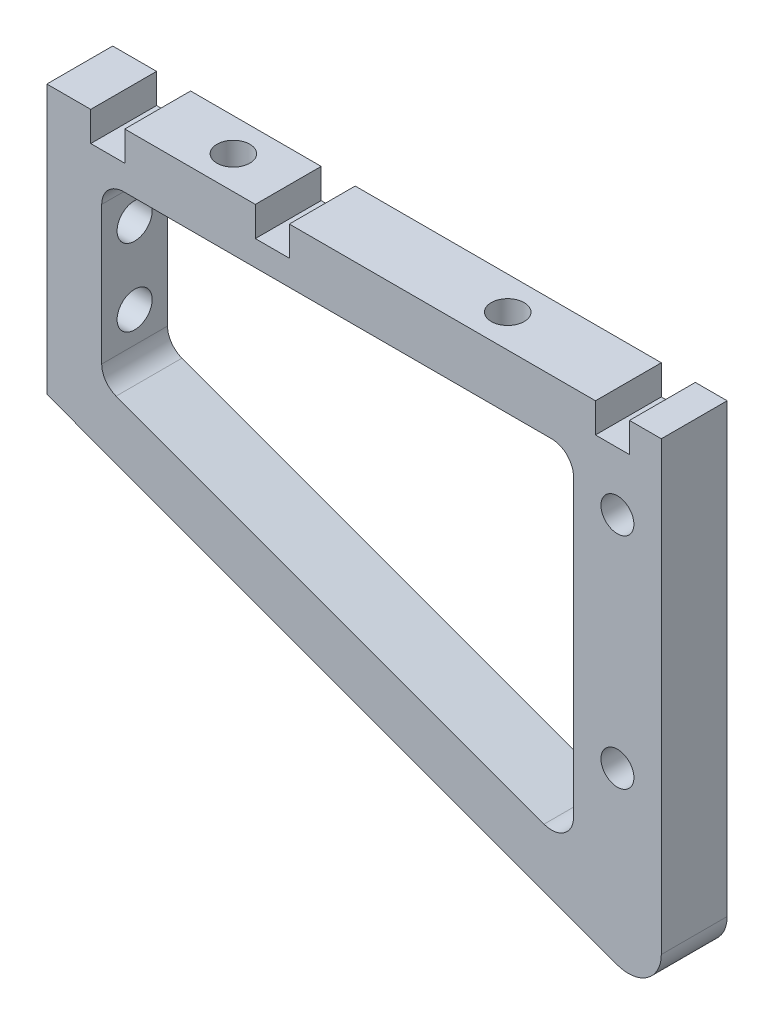
ISO-10303-21;
HEADER;
FILE_DESCRIPTION(('STEP AP214'),'2;1');
FILE_NAME('part.step','',(''),(''),'','','');
FILE_SCHEMA(('AUTOMOTIVE_DESIGN { 1 0 10303 214 1 1 1 1 }'));
ENDSEC;
DATA;
#1=APPLICATION_CONTEXT('core data for automotive mechanical design processes');
#2=APPLICATION_PROTOCOL_DEFINITION('international standard','automotive_design',2000,#1);
#3=PRODUCT_CONTEXT('',#1,'mechanical');
#4=PRODUCT('Part','Part','',(#3));
#5=PRODUCT_RELATED_PRODUCT_CATEGORY('part','',(#4));
#6=PRODUCT_DEFINITION_FORMATION('','',#4);
#7=PRODUCT_DEFINITION_CONTEXT('part definition',#1,'design');
#8=PRODUCT_DEFINITION('design','',#6,#7);
#9=PRODUCT_DEFINITION_SHAPE('','',#8);
#10=(LENGTH_UNIT() NAMED_UNIT(*) SI_UNIT(.MILLI.,.METRE.));
#11=(NAMED_UNIT(*) PLANE_ANGLE_UNIT() SI_UNIT($,.RADIAN.));
#12=(NAMED_UNIT(*) SI_UNIT($,.STERADIAN.) SOLID_ANGLE_UNIT());
#13=UNCERTAINTY_MEASURE_WITH_UNIT(LENGTH_MEASURE(1.E-05),#10,'distance_accuracy_value','');
#14=(GEOMETRIC_REPRESENTATION_CONTEXT(3) GLOBAL_UNCERTAINTY_ASSIGNED_CONTEXT((#13)) GLOBAL_UNIT_ASSIGNED_CONTEXT((#10,
#11,#12)) REPRESENTATION_CONTEXT('',''));
#15=CARTESIAN_POINT('',(0.,0.,0.));
#16=DIRECTION('',(0.,0.,1.));
#17=DIRECTION('',(1.,0.,0.));
#18=AXIS2_PLACEMENT_3D('',#15,#16,#17);
#19=CARTESIAN_POINT('',(0.,45.,6.));
#20=DIRECTION('',(0.,-1.,0.));
#21=DIRECTION('',(0.,0.,-1.));
#22=AXIS2_PLACEMENT_3D('',#19,#20,#21);
#23=PLANE('',#22);
#24=DIRECTION('',(-1.,0.,0.));
#25=VECTOR('',#24,1.);
#26=CARTESIAN_POINT('',(0.,45.,6.));
#27=LINE('',#26,#25);
#28=CARTESIAN_POINT('',(-52.,45.,6.));
#29=VERTEX_POINT('',#28);
#30=CARTESIAN_POINT('',(-56.,45.,6.));
#31=VERTEX_POINT('',#30);
#32=EDGE_CURVE('E352',#29,#31,#27,.T.);
#33=ORIENTED_EDGE('',*,*,#32,.F.);
#34=DIRECTION('',(0.,0.,1.));
#35=VECTOR('',#34,1.);
#36=CARTESIAN_POINT('',(-52.,45.,0.));
#37=LINE('',#36,#35);
#38=CARTESIAN_POINT('',(-52.,45.,0.));
#39=VERTEX_POINT('',#38);
#40=EDGE_CURVE('E240',#39,#29,#37,.T.);
#41=ORIENTED_EDGE('',*,*,#40,.F.);
#42=DIRECTION('',(-1.,0.,0.));
#43=VECTOR('',#42,1.);
#44=CARTESIAN_POINT('',(0.,45.,0.));
#45=LINE('',#44,#43);
#46=CARTESIAN_POINT('',(-56.,45.,0.));
#47=VERTEX_POINT('',#46);
#48=EDGE_CURVE('E227',#39,#47,#45,.T.);
#49=ORIENTED_EDGE('',*,*,#48,.T.);
#50=DIRECTION('',(0.,0.,-1.));
#51=VECTOR('',#50,1.);
#52=CARTESIAN_POINT('',(-56.,45.,6.));
#53=LINE('',#52,#51);
#54=EDGE_CURVE('E371',#31,#47,#53,.T.);
#55=ORIENTED_EDGE('',*,*,#54,.F.);
#56=EDGE_LOOP('',(#33,#41,#49,#55));
#57=FACE_BOUND('',#56,.T.);
#58=ADVANCED_FACE('F36',(#57),#23,.F.);
#59=CARTESIAN_POINT('',(-17.,45.,3.));
#60=DIRECTION('',(0.,1.,0.));
#61=DIRECTION('',(-1.,0.,0.));
#62=AXIS2_PLACEMENT_3D('',#59,#60,#61);
#63=CIRCLE('',#62,1.5);
#64=CARTESIAN_POINT('',(-18.5,45.,3.));
#65=VERTEX_POINT('',#64);
#66=EDGE_CURVE('E299',#65,#65,#63,.T.);
#67=ORIENTED_EDGE('',*,*,#66,.F.);
#68=EDGE_LOOP('',(#67));
#69=FACE_BOUND('',#68,.T.);
#70=CARTESIAN_POINT('',(-6.00000000000001,45.,0.));
#71=VERTEX_POINT('',#70);
#72=CARTESIAN_POINT('',(-33.9,45.,0.));
#73=VERTEX_POINT('',#72);
#74=EDGE_CURVE('E365',#71,#73,#45,.T.);
#75=ORIENTED_EDGE('',*,*,#74,.T.);
#76=DIRECTION('',(0.,0.,1.));
#77=VECTOR('',#76,1.);
#78=CARTESIAN_POINT('',(-33.9,45.,0.));
#79=LINE('',#78,#77);
#80=CARTESIAN_POINT('',(-33.9,45.,6.));
#81=VERTEX_POINT('',#80);
#82=EDGE_CURVE('E238',#73,#81,#79,.T.);
#83=ORIENTED_EDGE('',*,*,#82,.T.);
#84=CARTESIAN_POINT('',(-6.00000000000001,45.,6.));
#85=VERTEX_POINT('',#84);
#86=EDGE_CURVE('E357',#85,#81,#27,.T.);
#87=ORIENTED_EDGE('',*,*,#86,.F.);
#88=DIRECTION('',(0.,0.,1.));
#89=VECTOR('',#88,1.);
#90=CARTESIAN_POINT('',(-6.00000000000001,45.,0.));
#91=LINE('',#90,#89);
#92=EDGE_CURVE('E283',#71,#85,#91,.T.);
#93=ORIENTED_EDGE('',*,*,#92,.F.);
#94=EDGE_LOOP('',(#75,#83,#87,#93));
#95=FACE_BOUND('',#94,.T.);
#96=ADVANCED_FACE('F456',(#69,#95),#23,.F.);
#97=CARTESIAN_POINT('',(0.,45.,0.));
#98=VERTEX_POINT('',#97);
#99=CARTESIAN_POINT('',(-2.90000000000001,45.,0.));
#100=VERTEX_POINT('',#99);
#101=EDGE_CURVE('E361',#98,#100,#45,.T.);
#102=ORIENTED_EDGE('',*,*,#101,.T.);
#103=DIRECTION('',(0.,0.,1.));
#104=VECTOR('',#103,1.);
#105=CARTESIAN_POINT('',(-2.90000000000001,45.,0.));
#106=LINE('',#105,#104);
#107=CARTESIAN_POINT('',(-2.90000000000001,45.,6.));
#108=VERTEX_POINT('',#107);
#109=EDGE_CURVE('E262',#100,#108,#106,.T.);
#110=ORIENTED_EDGE('',*,*,#109,.T.);
#111=CARTESIAN_POINT('',(0.,45.,6.));
#112=VERTEX_POINT('',#111);
#113=EDGE_CURVE('E353',#112,#108,#27,.T.);
#114=ORIENTED_EDGE('',*,*,#113,.F.);
#115=DIRECTION('',(0.,0.,-1.));
#116=VECTOR('',#115,1.);
#117=CARTESIAN_POINT('',(0.,45.,6.));
#118=LINE('',#117,#116);
#119=EDGE_CURVE('E374',#112,#98,#118,.T.);
#120=ORIENTED_EDGE('',*,*,#119,.T.);
#121=EDGE_LOOP('',(#102,#110,#114,#120));
#122=FACE_BOUND('',#121,.T.);
#123=ADVANCED_FACE('F463',(#122),#23,.F.);
#124=CARTESIAN_POINT('',(0.,0.,6.));
#125=DIRECTION('',(0.,0.,1.));
#126=DIRECTION('',(1.,0.,0.));
#127=AXIS2_PLACEMENT_3D('',#124,#125,#126);
#128=PLANE('',#127);
#129=DIRECTION('',(0.,-1.,0.));
#130=VECTOR('',#129,1.);
#131=CARTESIAN_POINT('',(-52.,45.,6.));
#132=LINE('',#131,#130);
#133=CARTESIAN_POINT('',(-52.,42.3,6.));
#134=VERTEX_POINT('',#133);
#135=EDGE_CURVE('E209',#29,#134,#132,.T.);
#136=ORIENTED_EDGE('',*,*,#135,.F.);
#137=ORIENTED_EDGE('',*,*,#32,.T.);
#138=DIRECTION('',(0.,-1.,0.));
#139=VECTOR('',#138,1.);
#140=CARTESIAN_POINT('',(-56.,42.2669645968904,6.));
#141=LINE('',#140,#139);
#142=CARTESIAN_POINT('',(-56.,20.5062309358182,6.));
#143=VERTEX_POINT('',#142);
#144=EDGE_CURVE('E356',#31,#143,#141,.T.);
#145=ORIENTED_EDGE('',*,*,#144,.T.);
#146=DIRECTION('',(0.939023117694087,-0.343854016169766,0.));
#147=VECTOR('',#146,1.);
#148=CARTESIAN_POINT('',(-51.8981475838496,19.0042035624213,6.));
#149=LINE('',#148,#147);
#150=CARTESIAN_POINT('',(-4.0315620485093,1.47628825712164,6.));
#151=VERTEX_POINT('',#150);
#152=EDGE_CURVE('E346',#143,#151,#149,.T.);
#153=ORIENTED_EDGE('',*,*,#152,.T.);
#154=CARTESIAN_POINT('',(-3.,4.29335761020392,6.));
#155=DIRECTION('',(0.,0.,1.));
#156=DIRECTION('',(1.,0.,0.));
#157=AXIS2_PLACEMENT_3D('',#154,#155,#156);
#158=CIRCLE('',#157,3.);
#159=CARTESIAN_POINT('',(0.,4.29335761020392,6.));
#160=VERTEX_POINT('',#159);
#161=EDGE_CURVE('E384',#151,#160,#158,.T.);
#162=ORIENTED_EDGE('',*,*,#161,.T.);
#163=DIRECTION('',(0.,1.,0.));
#164=VECTOR('',#163,1.);
#165=CARTESIAN_POINT('',(0.,0.,6.));
#166=LINE('',#165,#164);
#167=EDGE_CURVE('E349',#160,#112,#166,.T.);
#168=ORIENTED_EDGE('',*,*,#167,.T.);
#169=ORIENTED_EDGE('',*,*,#113,.T.);
#170=DIRECTION('',(0.,1.,0.));
#171=VECTOR('',#170,1.);
#172=CARTESIAN_POINT('',(-2.90000000000001,45.,6.));
#173=LINE('',#172,#171);
#174=CARTESIAN_POINT('',(-2.90000000000001,42.3,6.));
#175=VERTEX_POINT('',#174);
#176=EDGE_CURVE('E277',#175,#108,#173,.T.);
#177=ORIENTED_EDGE('',*,*,#176,.F.);
#178=DIRECTION('',(1.,0.,0.));
#179=VECTOR('',#178,1.);
#180=CARTESIAN_POINT('',(-6.00000000000001,42.3,6.));
#181=LINE('',#180,#179);
#182=CARTESIAN_POINT('',(-6.00000000000001,42.3,6.));
#183=VERTEX_POINT('',#182);
#184=EDGE_CURVE('E287',#183,#175,#181,.T.);
#185=ORIENTED_EDGE('',*,*,#184,.F.);
#186=DIRECTION('',(0.,-1.,0.));
#187=VECTOR('',#186,1.);
#188=CARTESIAN_POINT('',(-6.00000000000001,45.,6.));
#189=LINE('',#188,#187);
#190=EDGE_CURVE('E284',#85,#183,#189,.T.);
#191=ORIENTED_EDGE('',*,*,#190,.F.);
#192=ORIENTED_EDGE('',*,*,#86,.T.);
#193=DIRECTION('',(0.,1.,0.));
#194=VECTOR('',#193,1.);
#195=CARTESIAN_POINT('',(-33.9,45.,6.));
#196=LINE('',#195,#194);
#197=CARTESIAN_POINT('',(-33.9,42.3,6.));
#198=VERTEX_POINT('',#197);
#199=EDGE_CURVE('E251',#198,#81,#196,.T.);
#200=ORIENTED_EDGE('',*,*,#199,.F.);
#201=DIRECTION('',(1.,0.,0.));
#202=VECTOR('',#201,1.);
#203=CARTESIAN_POINT('',(-37.,42.3,6.));
#204=LINE('',#203,#202);
#205=CARTESIAN_POINT('',(-37.,42.3,6.));
#206=VERTEX_POINT('',#205);
#207=EDGE_CURVE('E261',#206,#198,#204,.T.);
#208=ORIENTED_EDGE('',*,*,#207,.F.);
#209=DIRECTION('',(0.,-1.,0.));
#210=VECTOR('',#209,1.);
#211=CARTESIAN_POINT('',(-37.,45.,6.));
#212=LINE('',#211,#210);
#213=CARTESIAN_POINT('',(-37.,45.,6.));
#214=VERTEX_POINT('',#213);
#215=EDGE_CURVE('E258',#214,#206,#212,.T.);
#216=ORIENTED_EDGE('',*,*,#215,.F.);
#217=CARTESIAN_POINT('',(-48.9,45.,6.));
#218=VERTEX_POINT('',#217);
#219=EDGE_CURVE('E530',#214,#218,#27,.T.);
#220=ORIENTED_EDGE('',*,*,#219,.T.);
#221=DIRECTION('',(0.,1.,0.));
#222=VECTOR('',#221,1.);
#223=CARTESIAN_POINT('',(-48.9,45.,6.));
#224=LINE('',#223,#222);
#225=CARTESIAN_POINT('',(-48.9,42.3,6.));
#226=VERTEX_POINT('',#225);
#227=EDGE_CURVE('E228',#226,#218,#224,.T.);
#228=ORIENTED_EDGE('',*,*,#227,.F.);
#229=DIRECTION('',(1.,0.,0.));
#230=VECTOR('',#229,1.);
#231=CARTESIAN_POINT('',(-52.,42.3,6.));
#232=LINE('',#231,#230);
#233=EDGE_CURVE('E230',#134,#226,#232,.T.);
#234=ORIENTED_EDGE('',*,*,#233,.F.);
#235=EDGE_LOOP('',(#136,#137,#145,#153,#162,#168,#169,#177,#185,#191,#192,#200,#208,#216,#220,
#228,#234));
#236=FACE_BOUND('',#235,.T.);
#237=CARTESIAN_POINT('',(-4.,37.,6.));
#238=DIRECTION('',(0.,0.,1.));
#239=DIRECTION('',(1.,0.,0.));
#240=AXIS2_PLACEMENT_3D('',#237,#238,#239);
#241=CIRCLE('',#240,1.5);
#242=CARTESIAN_POINT('',(-2.5,37.,6.));
#243=VERTEX_POINT('',#242);
#244=EDGE_CURVE('E317',#243,#243,#241,.T.);
#245=ORIENTED_EDGE('',*,*,#244,.F.);
#246=EDGE_LOOP('',(#245));
#247=FACE_BOUND('',#246,.T.);
#248=DIRECTION('',(0.939023117694086,-0.343854016169766,0.));
#249=VECTOR('',#248,1.);
#250=CARTESIAN_POINT('',(-45.845984401345,22.1126886765566,6.));
#251=LINE('',#250,#249);
#252=CARTESIAN_POINT('',(-49.6877080323395,23.5194613902846,6.));
#253=VERTEX_POINT('',#252);
#254=CARTESIAN_POINT('',(-10.6877080323395,9.23833627426832,6.));
#255=VERTEX_POINT('',#254);
#256=EDGE_CURVE('E330',#253,#255,#251,.T.);
#257=ORIENTED_EDGE('',*,*,#256,.F.);
#258=CARTESIAN_POINT('',(-49.,25.3975076256727,6.));
#259=DIRECTION('',(0.,0.,1.));
#260=DIRECTION('',(1.,0.,0.));
#261=AXIS2_PLACEMENT_3D('',#258,#259,#260);
#262=CIRCLE('',#261,2.);
#263=CARTESIAN_POINT('',(-51.,25.3975076256727,6.));
#264=VERTEX_POINT('',#263);
#265=EDGE_CURVE('E407',#253,#264,#262,.F.);
#266=ORIENTED_EDGE('',*,*,#265,.T.);
#267=DIRECTION('',(0.,-1.,0.));
#268=VECTOR('',#267,1.);
#269=CARTESIAN_POINT('',(-51.,40.,6.));
#270=LINE('',#269,#268);
#271=CARTESIAN_POINT('',(-51.,38.,6.));
#272=VERTEX_POINT('',#271);
#273=EDGE_CURVE('E326',#272,#264,#270,.T.);
#274=ORIENTED_EDGE('',*,*,#273,.F.);
#275=CARTESIAN_POINT('',(-49.,38.,6.));
#276=DIRECTION('',(0.,0.,1.));
#277=DIRECTION('',(1.,0.,0.));
#278=AXIS2_PLACEMENT_3D('',#275,#276,#277);
#279=CIRCLE('',#278,2.);
#280=CARTESIAN_POINT('',(-49.,40.,6.));
#281=VERTEX_POINT('',#280);
#282=EDGE_CURVE('E411',#272,#281,#279,.F.);
#283=ORIENTED_EDGE('',*,*,#282,.T.);
#284=DIRECTION('',(-1.,0.,0.));
#285=VECTOR('',#284,1.);
#286=CARTESIAN_POINT('',(-49.,40.,6.));
#287=LINE('',#286,#285);
#288=CARTESIAN_POINT('',(-10.,40.,6.));
#289=VERTEX_POINT('',#288);
#290=EDGE_CURVE('E323',#289,#281,#287,.T.);
#291=ORIENTED_EDGE('',*,*,#290,.F.);
#292=CARTESIAN_POINT('',(-10.,38.,6.));
#293=DIRECTION('',(0.,0.,1.));
#294=DIRECTION('',(1.,0.,0.));
#295=AXIS2_PLACEMENT_3D('',#292,#293,#294);
#296=CIRCLE('',#295,2.);
#297=CARTESIAN_POINT('',(-8.,38.,6.));
#298=VERTEX_POINT('',#297);
#299=EDGE_CURVE('E11',#289,#298,#296,.F.);
#300=ORIENTED_EDGE('',*,*,#299,.T.);
#301=DIRECTION('',(0.,1.,0.));
#302=VECTOR('',#301,1.);
#303=CARTESIAN_POINT('',(-8.,40.,6.));
#304=LINE('',#303,#302);
#305=CARTESIAN_POINT('',(-8.,11.1163825096565,6.));
#306=VERTEX_POINT('',#305);
#307=EDGE_CURVE('E333',#306,#298,#304,.T.);
#308=ORIENTED_EDGE('',*,*,#307,.F.);
#309=CARTESIAN_POINT('',(-10.,11.1163825096565,6.));
#310=DIRECTION('',(0.,0.,1.));
#311=DIRECTION('',(1.,0.,0.));
#312=AXIS2_PLACEMENT_3D('',#309,#310,#311);
#313=CIRCLE('',#312,2.);
#314=EDGE_CURVE('E415',#306,#255,#313,.F.);
#315=ORIENTED_EDGE('',*,*,#314,.T.);
#316=EDGE_LOOP('',(#257,#266,#274,#283,#291,#300,#308,#315));
#317=FACE_BOUND('',#316,.T.);
#318=CARTESIAN_POINT('',(-4.,17.,6.));
#319=DIRECTION('',(0.,0.,1.));
#320=DIRECTION('',(1.,0.,0.));
#321=AXIS2_PLACEMENT_3D('',#318,#319,#320);
#322=CIRCLE('',#321,1.5);
#323=CARTESIAN_POINT('',(-2.5,17.,6.));
#324=VERTEX_POINT('',#323);
#325=EDGE_CURVE('E311',#324,#324,#322,.T.);
#326=ORIENTED_EDGE('',*,*,#325,.F.);
#327=EDGE_LOOP('',(#326));
#328=FACE_BOUND('',#327,.T.);
#329=ADVANCED_FACE('F427',(#236,#247,#317,#328),#128,.T.);
#330=CARTESIAN_POINT('',(0.,0.,0.));
#331=DIRECTION('',(0.,0.,1.));
#332=DIRECTION('',(1.,0.,0.));
#333=AXIS2_PLACEMENT_3D('',#330,#331,#332);
#334=PLANE('',#333);
#335=ORIENTED_EDGE('',*,*,#48,.F.);
#336=DIRECTION('',(0.,-1.,0.));
#337=VECTOR('',#336,1.);
#338=CARTESIAN_POINT('',(-52.,45.,0.));
#339=LINE('',#338,#337);
#340=CARTESIAN_POINT('',(-52.,42.3,0.));
#341=VERTEX_POINT('',#340);
#342=EDGE_CURVE('E206',#39,#341,#339,.T.);
#343=ORIENTED_EDGE('',*,*,#342,.T.);
#344=DIRECTION('',(1.,0.,0.));
#345=VECTOR('',#344,1.);
#346=CARTESIAN_POINT('',(-52.,42.3,0.));
#347=LINE('',#346,#345);
#348=CARTESIAN_POINT('',(-48.9,42.3,0.));
#349=VERTEX_POINT('',#348);
#350=EDGE_CURVE('E217',#341,#349,#347,.T.);
#351=ORIENTED_EDGE('',*,*,#350,.T.);
#352=DIRECTION('',(0.,1.,0.));
#353=VECTOR('',#352,1.);
#354=CARTESIAN_POINT('',(-48.9,45.,0.));
#355=LINE('',#354,#353);
#356=CARTESIAN_POINT('',(-48.9,45.,0.));
#357=VERTEX_POINT('',#356);
#358=EDGE_CURVE('E214',#349,#357,#355,.T.);
#359=ORIENTED_EDGE('',*,*,#358,.T.);
#360=CARTESIAN_POINT('',(-37.,45.,0.));
#361=VERTEX_POINT('',#360);
#362=EDGE_CURVE('E513',#361,#357,#45,.T.);
#363=ORIENTED_EDGE('',*,*,#362,.F.);
#364=DIRECTION('',(0.,-1.,0.));
#365=VECTOR('',#364,1.);
#366=CARTESIAN_POINT('',(-37.,45.,0.));
#367=LINE('',#366,#365);
#368=CARTESIAN_POINT('',(-37.,42.3,0.));
#369=VERTEX_POINT('',#368);
#370=EDGE_CURVE('E247',#361,#369,#367,.T.);
#371=ORIENTED_EDGE('',*,*,#370,.T.);
#372=DIRECTION('',(1.,0.,0.));
#373=VECTOR('',#372,1.);
#374=CARTESIAN_POINT('',(-37.,42.3,0.));
#375=LINE('',#374,#373);
#376=CARTESIAN_POINT('',(-33.9,42.3,0.));
#377=VERTEX_POINT('',#376);
#378=EDGE_CURVE('E250',#369,#377,#375,.T.);
#379=ORIENTED_EDGE('',*,*,#378,.T.);
#380=DIRECTION('',(0.,1.,0.));
#381=VECTOR('',#380,1.);
#382=CARTESIAN_POINT('',(-33.9,45.,0.));
#383=LINE('',#382,#381);
#384=EDGE_CURVE('E254',#377,#73,#383,.T.);
#385=ORIENTED_EDGE('',*,*,#384,.T.);
#386=ORIENTED_EDGE('',*,*,#74,.F.);
#387=DIRECTION('',(0.,-1.,0.));
#388=VECTOR('',#387,1.);
#389=CARTESIAN_POINT('',(-6.00000000000001,45.,0.));
#390=LINE('',#389,#388);
#391=CARTESIAN_POINT('',(-6.00000000000001,42.3,0.));
#392=VERTEX_POINT('',#391);
#393=EDGE_CURVE('E273',#71,#392,#390,.T.);
#394=ORIENTED_EDGE('',*,*,#393,.T.);
#395=DIRECTION('',(1.,0.,0.));
#396=VECTOR('',#395,1.);
#397=CARTESIAN_POINT('',(-6.00000000000001,42.3,0.));
#398=LINE('',#397,#396);
#399=CARTESIAN_POINT('',(-2.90000000000001,42.3,0.));
#400=VERTEX_POINT('',#399);
#401=EDGE_CURVE('E276',#392,#400,#398,.T.);
#402=ORIENTED_EDGE('',*,*,#401,.T.);
#403=DIRECTION('',(0.,1.,0.));
#404=VECTOR('',#403,1.);
#405=CARTESIAN_POINT('',(-2.90000000000001,45.,0.));
#406=LINE('',#405,#404);
#407=EDGE_CURVE('E280',#400,#100,#406,.T.);
#408=ORIENTED_EDGE('',*,*,#407,.T.);
#409=ORIENTED_EDGE('',*,*,#101,.F.);
#410=DIRECTION('',(0.,1.,0.));
#411=VECTOR('',#410,1.);
#412=CARTESIAN_POINT('',(0.,0.,0.));
#413=LINE('',#412,#411);
#414=CARTESIAN_POINT('',(0.,4.29335761020392,0.));
#415=VERTEX_POINT('',#414);
#416=EDGE_CURVE('E335',#415,#98,#413,.T.);
#417=ORIENTED_EDGE('',*,*,#416,.F.);
#418=CARTESIAN_POINT('',(-3.,4.29335761020392,0.));
#419=DIRECTION('',(0.,0.,1.));
#420=DIRECTION('',(1.,0.,0.));
#421=AXIS2_PLACEMENT_3D('',#418,#419,#420);
#422=CIRCLE('',#421,3.);
#423=CARTESIAN_POINT('',(-4.0315620485093,1.47628825712166,0.));
#424=VERTEX_POINT('',#423);
#425=EDGE_CURVE('E380',#415,#424,#422,.F.);
#426=ORIENTED_EDGE('',*,*,#425,.T.);
#427=DIRECTION('',(0.939023117694087,-0.343854016169766,0.));
#428=VECTOR('',#427,1.);
#429=CARTESIAN_POINT('',(-56.,20.5062309358182,0.));
#430=LINE('',#429,#428);
#431=CARTESIAN_POINT('',(-56.,20.5062309358182,0.));
#432=VERTEX_POINT('',#431);
#433=EDGE_CURVE('E350',#432,#424,#430,.T.);
#434=ORIENTED_EDGE('',*,*,#433,.F.);
#435=DIRECTION('',(0.,-1.,0.));
#436=VECTOR('',#435,1.);
#437=CARTESIAN_POINT('',(-56.,42.2669645968904,0.));
#438=LINE('',#437,#436);
#439=EDGE_CURVE('E364',#47,#432,#438,.T.);
#440=ORIENTED_EDGE('',*,*,#439,.F.);
#441=EDGE_LOOP('',(#335,#343,#351,#359,#363,#371,#379,#385,#386,#394,#402,#408,#409,#417,#426,
#434,#440));
#442=FACE_BOUND('',#441,.T.);
#443=DIRECTION('',(-1.,0.,0.));
#444=VECTOR('',#443,1.);
#445=CARTESIAN_POINT('',(-49.,40.,0.));
#446=LINE('',#445,#444);
#447=CARTESIAN_POINT('',(-10.,40.,0.));
#448=VERTEX_POINT('',#447);
#449=CARTESIAN_POINT('',(-49.,40.,0.));
#450=VERTEX_POINT('',#449);
#451=EDGE_CURVE('E327',#448,#450,#446,.T.);
#452=ORIENTED_EDGE('',*,*,#451,.T.);
#453=CARTESIAN_POINT('',(-49.,38.,0.));
#454=DIRECTION('',(0.,0.,1.));
#455=DIRECTION('',(1.,0.,0.));
#456=AXIS2_PLACEMENT_3D('',#453,#454,#455);
#457=CIRCLE('',#456,2.);
#458=CARTESIAN_POINT('',(-51.,38.,0.));
#459=VERTEX_POINT('',#458);
#460=EDGE_CURVE('E409',#450,#459,#457,.T.);
#461=ORIENTED_EDGE('',*,*,#460,.T.);
#462=DIRECTION('',(0.,-1.,0.));
#463=VECTOR('',#462,1.);
#464=CARTESIAN_POINT('',(-51.,40.,0.));
#465=LINE('',#464,#463);
#466=CARTESIAN_POINT('',(-51.,25.3975076256727,0.));
#467=VERTEX_POINT('',#466);
#468=EDGE_CURVE('E320',#459,#467,#465,.T.);
#469=ORIENTED_EDGE('',*,*,#468,.T.);
#470=CARTESIAN_POINT('',(-49.,25.3975076256727,0.));
#471=DIRECTION('',(0.,0.,1.));
#472=DIRECTION('',(1.,0.,0.));
#473=AXIS2_PLACEMENT_3D('',#470,#471,#472);
#474=CIRCLE('',#473,2.);
#475=CARTESIAN_POINT('',(-49.6877080323395,23.5194613902845,0.));
#476=VERTEX_POINT('',#475);
#477=EDGE_CURVE('E405',#467,#476,#474,.T.);
#478=ORIENTED_EDGE('',*,*,#477,.T.);
#479=DIRECTION('',(0.939023117694087,-0.343854016169766,0.));
#480=VECTOR('',#479,1.);
#481=CARTESIAN_POINT('',(-8.,8.25414410285391,0.));
#482=LINE('',#481,#480);
#483=CARTESIAN_POINT('',(-10.6877080323395,9.23833627426834,0.));
#484=VERTEX_POINT('',#483);
#485=EDGE_CURVE('E338',#476,#484,#482,.T.);
#486=ORIENTED_EDGE('',*,*,#485,.T.);
#487=CARTESIAN_POINT('',(-10.,11.1163825096565,0.));
#488=DIRECTION('',(0.,0.,1.));
#489=DIRECTION('',(1.,0.,0.));
#490=AXIS2_PLACEMENT_3D('',#487,#488,#489);
#491=CIRCLE('',#490,2.);
#492=CARTESIAN_POINT('',(-8.,11.1163825096565,0.));
#493=VERTEX_POINT('',#492);
#494=EDGE_CURVE('E413',#484,#493,#491,.T.);
#495=ORIENTED_EDGE('',*,*,#494,.T.);
#496=DIRECTION('',(0.,1.,0.));
#497=VECTOR('',#496,1.);
#498=CARTESIAN_POINT('',(-8.,40.,0.));
#499=LINE('',#498,#497);
#500=CARTESIAN_POINT('',(-8.,38.,0.));
#501=VERTEX_POINT('',#500);
#502=EDGE_CURVE('E341',#493,#501,#499,.T.);
#503=ORIENTED_EDGE('',*,*,#502,.T.);
#504=CARTESIAN_POINT('',(-10.,38.,0.));
#505=DIRECTION('',(0.,0.,1.));
#506=DIRECTION('',(1.,0.,0.));
#507=AXIS2_PLACEMENT_3D('',#504,#505,#506);
#508=CIRCLE('',#507,2.);
#509=EDGE_CURVE('E44',#501,#448,#508,.T.);
#510=ORIENTED_EDGE('',*,*,#509,.T.);
#511=EDGE_LOOP('',(#452,#461,#469,#478,#486,#495,#503,#510));
#512=FACE_BOUND('',#511,.T.);
#513=CARTESIAN_POINT('',(-4.,37.,0.));
#514=DIRECTION('',(0.,0.,1.));
#515=DIRECTION('',(1.,0.,0.));
#516=AXIS2_PLACEMENT_3D('',#513,#514,#515);
#517=CIRCLE('',#516,1.5);
#518=CARTESIAN_POINT('',(-2.5,37.,0.));
#519=VERTEX_POINT('',#518);
#520=EDGE_CURVE('E314',#519,#519,#517,.T.);
#521=ORIENTED_EDGE('',*,*,#520,.T.);
#522=EDGE_LOOP('',(#521));
#523=FACE_BOUND('',#522,.T.);
#524=CARTESIAN_POINT('',(-4.,17.,0.));
#525=DIRECTION('',(0.,0.,1.));
#526=DIRECTION('',(1.,0.,0.));
#527=AXIS2_PLACEMENT_3D('',#524,#525,#526);
#528=CIRCLE('',#527,1.5);
#529=CARTESIAN_POINT('',(-2.5,17.,0.));
#530=VERTEX_POINT('',#529);
#531=EDGE_CURVE('E302',#530,#530,#528,.T.);
#532=ORIENTED_EDGE('',*,*,#531,.T.);
#533=EDGE_LOOP('',(#532));
#534=FACE_BOUND('',#533,.T.);
#535=ADVANCED_FACE('F224',(#442,#512,#523,#534),#334,.F.);
#536=CARTESIAN_POINT('',(0.,0.,6.));
#537=DIRECTION('',(-1.,0.,0.));
#538=DIRECTION('',(0.,0.,1.));
#539=AXIS2_PLACEMENT_3D('',#536,#537,#538);
#540=PLANE('',#539);
#541=ORIENTED_EDGE('',*,*,#167,.F.);
#542=DIRECTION('',(0.,0.,-1.));
#543=VECTOR('',#542,1.);
#544=CARTESIAN_POINT('',(0.,4.29335761020392,6.));
#545=LINE('',#544,#543);
#546=EDGE_CURVE('E377',#160,#415,#545,.T.);
#547=ORIENTED_EDGE('',*,*,#546,.T.);
#548=ORIENTED_EDGE('',*,*,#416,.T.);
#549=ORIENTED_EDGE('',*,*,#119,.F.);
#550=EDGE_LOOP('',(#541,#547,#548,#549));
#551=FACE_BOUND('',#550,.T.);
#552=ADVANCED_FACE('F470',(#551),#540,.F.);
#553=CARTESIAN_POINT('',(-42.,45.,3.00000000000001));
#554=DIRECTION('',(0.,1.,0.));
#555=DIRECTION('',(-1.,0.,0.));
#556=AXIS2_PLACEMENT_3D('',#553,#554,#555);
#557=CIRCLE('',#556,1.5);
#558=CARTESIAN_POINT('',(-43.5,45.,3.00000000000001));
#559=VERTEX_POINT('',#558);
#560=EDGE_CURVE('E306',#559,#559,#557,.T.);
#561=ORIENTED_EDGE('',*,*,#560,.F.);
#562=EDGE_LOOP('',(#561));
#563=FACE_BOUND('',#562,.T.);
#564=ORIENTED_EDGE('',*,*,#362,.T.);
#565=DIRECTION('',(0.,0.,1.));
#566=VECTOR('',#565,1.);
#567=CARTESIAN_POINT('',(-48.9,45.,0.));
#568=LINE('',#567,#566);
#569=EDGE_CURVE('E243',#357,#218,#568,.T.);
#570=ORIENTED_EDGE('',*,*,#569,.T.);
#571=ORIENTED_EDGE('',*,*,#219,.F.);
#572=DIRECTION('',(0.,0.,1.));
#573=VECTOR('',#572,1.);
#574=CARTESIAN_POINT('',(-37.,45.,0.));
#575=LINE('',#574,#573);
#576=EDGE_CURVE('E257',#361,#214,#575,.T.);
#577=ORIENTED_EDGE('',*,*,#576,.F.);
#578=EDGE_LOOP('',(#564,#570,#571,#577));
#579=FACE_BOUND('',#578,.T.);
#580=ADVANCED_FACE('F459',(#563,#579),#23,.F.);
#581=CARTESIAN_POINT('',(-56.,42.2669645968904,6.));
#582=DIRECTION('',(1.,0.,0.));
#583=DIRECTION('',(0.,0.,-1.));
#584=AXIS2_PLACEMENT_3D('',#581,#582,#583);
#585=PLANE('',#584);
#586=CARTESIAN_POINT('',(-56.,35.1987538128364,3.));
#587=DIRECTION('',(1.,0.,0.));
#588=DIRECTION('',(0.,0.,-1.));
#589=AXIS2_PLACEMENT_3D('',#586,#587,#588);
#590=CIRCLE('',#589,1.6);
#591=CARTESIAN_POINT('',(-56.,35.1987538128364,1.4));
#592=VERTEX_POINT('',#591);
#593=EDGE_CURVE('E288',#592,#592,#590,.T.);
#594=ORIENTED_EDGE('',*,*,#593,.T.);
#595=EDGE_LOOP('',(#594));
#596=FACE_BOUND('',#595,.T.);
#597=CARTESIAN_POINT('',(-56.,28.1987538128364,3.));
#598=DIRECTION('',(1.,0.,0.));
#599=DIRECTION('',(0.,0.,-1.));
#600=AXIS2_PLACEMENT_3D('',#597,#598,#599);
#601=CIRCLE('',#600,1.6);
#602=CARTESIAN_POINT('',(-56.,28.1987538128364,1.4));
#603=VERTEX_POINT('',#602);
#604=EDGE_CURVE('E811',#603,#603,#601,.T.);
#605=ORIENTED_EDGE('',*,*,#604,.T.);
#606=EDGE_LOOP('',(#605));
#607=FACE_BOUND('',#606,.T.);
#608=ORIENTED_EDGE('',*,*,#439,.T.);
#609=DIRECTION('',(0.,0.,-1.));
#610=VECTOR('',#609,1.);
#611=CARTESIAN_POINT('',(-56.,20.5062309358182,6.));
#612=LINE('',#611,#610);
#613=EDGE_CURVE('E359',#143,#432,#612,.T.);
#614=ORIENTED_EDGE('',*,*,#613,.F.);
#615=ORIENTED_EDGE('',*,*,#144,.F.);
#616=ORIENTED_EDGE('',*,*,#54,.T.);
#617=EDGE_LOOP('',(#608,#614,#615,#616));
#618=FACE_BOUND('',#617,.T.);
#619=ADVANCED_FACE('F469',(#596,#607,#618),#585,.F.);
#620=CARTESIAN_POINT('',(-56.,20.5062309358182,6.));
#621=DIRECTION('',(0.343854016169766,0.939023117694087,0.));
#622=DIRECTION('',(-0.939023117694087,0.343854016169766,0.));
#623=AXIS2_PLACEMENT_3D('',#620,#621,#622);
#624=PLANE('',#623);
#625=ORIENTED_EDGE('',*,*,#433,.T.);
#626=DIRECTION('',(0.,0.,-1.));
#627=VECTOR('',#626,1.);
#628=CARTESIAN_POINT('',(-4.03156204850929,1.47628825712166,6.));
#629=LINE('',#628,#627);
#630=EDGE_CURVE('E382',#424,#151,#629,.F.);
#631=ORIENTED_EDGE('',*,*,#630,.T.);
#632=ORIENTED_EDGE('',*,*,#152,.F.);
#633=ORIENTED_EDGE('',*,*,#613,.T.);
#634=EDGE_LOOP('',(#625,#631,#632,#633));
#635=FACE_BOUND('',#634,.T.);
#636=ADVANCED_FACE('F476',(#635),#624,.F.);
#637=CARTESIAN_POINT('',(-51.,40.,6.));
#638=DIRECTION('',(1.,0.,0.));
#639=DIRECTION('',(0.,0.,-1.));
#640=AXIS2_PLACEMENT_3D('',#637,#638,#639);
#641=PLANE('',#640);
#642=CARTESIAN_POINT('',(-51.,35.1987538128364,3.));
#643=DIRECTION('',(1.,0.,0.));
#644=DIRECTION('',(0.,0.,-1.));
#645=AXIS2_PLACEMENT_3D('',#642,#643,#644);
#646=CIRCLE('',#645,1.6);
#647=CARTESIAN_POINT('',(-51.,35.1987538128364,1.4));
#648=VERTEX_POINT('',#647);
#649=EDGE_CURVE('E810',#648,#648,#646,.T.);
#650=ORIENTED_EDGE('',*,*,#649,.F.);
#651=EDGE_LOOP('',(#650));
#652=FACE_BOUND('',#651,.T.);
#653=CARTESIAN_POINT('',(-51.,28.1987538128364,3.));
#654=DIRECTION('',(1.,0.,0.));
#655=DIRECTION('',(0.,0.,-1.));
#656=AXIS2_PLACEMENT_3D('',#653,#654,#655);
#657=CIRCLE('',#656,1.6);
#658=CARTESIAN_POINT('',(-51.,28.1987538128364,1.4));
#659=VERTEX_POINT('',#658);
#660=EDGE_CURVE('E233',#659,#659,#657,.T.);
#661=ORIENTED_EDGE('',*,*,#660,.F.);
#662=EDGE_LOOP('',(#661));
#663=FACE_BOUND('',#662,.T.);
#664=ORIENTED_EDGE('',*,*,#273,.T.);
#665=DIRECTION('',(0.,0.,-1.));
#666=VECTOR('',#665,1.);
#667=CARTESIAN_POINT('',(-51.,25.3975076256727,0.));
#668=LINE('',#667,#666);
#669=EDGE_CURVE('E388',#264,#467,#668,.T.);
#670=ORIENTED_EDGE('',*,*,#669,.T.);
#671=ORIENTED_EDGE('',*,*,#468,.F.);
#672=DIRECTION('',(0.,0.,-1.));
#673=VECTOR('',#672,1.);
#674=CARTESIAN_POINT('',(-51.,38.,6.));
#675=LINE('',#674,#673);
#676=EDGE_CURVE('E386',#459,#272,#675,.F.);
#677=ORIENTED_EDGE('',*,*,#676,.T.);
#678=EDGE_LOOP('',(#664,#670,#671,#677));
#679=FACE_BOUND('',#678,.T.);
#680=ADVANCED_FACE('F442',(#652,#663,#679),#641,.T.);
#681=CARTESIAN_POINT('',(-8.,8.25414410285391,6.));
#682=DIRECTION('',(0.343854016169766,0.939023117694087,0.));
#683=DIRECTION('',(-0.939023117694087,0.343854016169766,0.));
#684=AXIS2_PLACEMENT_3D('',#681,#682,#683);
#685=PLANE('',#684);
#686=ORIENTED_EDGE('',*,*,#485,.F.);
#687=DIRECTION('',(0.,0.,-1.));
#688=VECTOR('',#687,1.);
#689=CARTESIAN_POINT('',(-49.6877080323395,23.5194613902846,6.));
#690=LINE('',#689,#688);
#691=EDGE_CURVE('E394',#476,#253,#690,.F.);
#692=ORIENTED_EDGE('',*,*,#691,.T.);
#693=ORIENTED_EDGE('',*,*,#256,.T.);
#694=DIRECTION('',(0.,0.,-1.));
#695=VECTOR('',#694,1.);
#696=CARTESIAN_POINT('',(-10.6877080323395,9.23833627426834,0.));
#697=LINE('',#696,#695);
#698=EDGE_CURVE('E391',#255,#484,#697,.T.);
#699=ORIENTED_EDGE('',*,*,#698,.T.);
#700=EDGE_LOOP('',(#686,#692,#693,#699));
#701=FACE_BOUND('',#700,.T.);
#702=ADVANCED_FACE('F434',(#701),#685,.T.);
#703=CARTESIAN_POINT('',(-8.,40.,6.));
#704=DIRECTION('',(-1.,0.,0.));
#705=DIRECTION('',(0.,-1.,0.));
#706=AXIS2_PLACEMENT_3D('',#703,#704,#705);
#707=PLANE('',#706);
#708=ORIENTED_EDGE('',*,*,#502,.F.);
#709=DIRECTION('',(0.,0.,-1.));
#710=VECTOR('',#709,1.);
#711=CARTESIAN_POINT('',(-8.,11.1163825096565,6.));
#712=LINE('',#711,#710);
#713=EDGE_CURVE('E56',#493,#306,#712,.F.);
#714=ORIENTED_EDGE('',*,*,#713,.T.);
#715=ORIENTED_EDGE('',*,*,#307,.T.);
#716=DIRECTION('',(0.,0.,-1.));
#717=VECTOR('',#716,1.);
#718=CARTESIAN_POINT('',(-8.,38.,0.));
#719=LINE('',#718,#717);
#720=EDGE_CURVE('E401',#298,#501,#719,.T.);
#721=ORIENTED_EDGE('',*,*,#720,.T.);
#722=EDGE_LOOP('',(#708,#714,#715,#721));
#723=FACE_BOUND('',#722,.T.);
#724=ADVANCED_FACE('F424',(#723),#707,.T.);
#725=CARTESIAN_POINT('',(-49.,40.,6.));
#726=DIRECTION('',(0.,-1.,0.));
#727=DIRECTION('',(0.,0.,-1.));
#728=AXIS2_PLACEMENT_3D('',#725,#726,#727);
#729=PLANE('',#728);
#730=CARTESIAN_POINT('',(-17.,40.,3.));
#731=DIRECTION('',(0.,-1.,0.));
#732=DIRECTION('',(0.,0.,-1.));
#733=AXIS2_PLACEMENT_3D('',#730,#731,#732);
#734=CIRCLE('',#733,1.5);
#735=CARTESIAN_POINT('',(-17.,40.,1.5));
#736=VERTEX_POINT('',#735);
#737=EDGE_CURVE('E303',#736,#736,#734,.F.);
#738=ORIENTED_EDGE('',*,*,#737,.T.);
#739=EDGE_LOOP('',(#738));
#740=FACE_BOUND('',#739,.T.);
#741=CARTESIAN_POINT('',(-42.,40.,3.00000000000001));
#742=DIRECTION('',(0.,-1.,0.));
#743=DIRECTION('',(0.,0.,-1.));
#744=AXIS2_PLACEMENT_3D('',#741,#742,#743);
#745=CIRCLE('',#744,1.5);
#746=CARTESIAN_POINT('',(-42.,40.,1.50000000000001));
#747=VERTEX_POINT('',#746);
#748=EDGE_CURVE('E242',#747,#747,#745,.F.);
#749=ORIENTED_EDGE('',*,*,#748,.T.);
#750=EDGE_LOOP('',(#749));
#751=FACE_BOUND('',#750,.T.);
#752=ORIENTED_EDGE('',*,*,#290,.T.);
#753=DIRECTION('',(0.,0.,-1.));
#754=VECTOR('',#753,1.);
#755=CARTESIAN_POINT('',(-49.,40.,0.));
#756=LINE('',#755,#754);
#757=EDGE_CURVE('E398',#281,#450,#756,.T.);
#758=ORIENTED_EDGE('',*,*,#757,.T.);
#759=ORIENTED_EDGE('',*,*,#451,.F.);
#760=DIRECTION('',(0.,0.,-1.));
#761=VECTOR('',#760,1.);
#762=CARTESIAN_POINT('',(-10.,40.,6.));
#763=LINE('',#762,#761);
#764=EDGE_CURVE('E396',#448,#289,#763,.F.);
#765=ORIENTED_EDGE('',*,*,#764,.T.);
#766=EDGE_LOOP('',(#752,#758,#759,#765));
#767=FACE_BOUND('',#766,.T.);
#768=ADVANCED_FACE('F422',(#740,#751,#767),#729,.T.);
#769=CARTESIAN_POINT('',(-4.,37.,6.));
#770=DIRECTION('',(0.,0.,-1.));
#771=DIRECTION('',(-1.,0.,0.));
#772=AXIS2_PLACEMENT_3D('',#769,#770,#771);
#773=CYLINDRICAL_SURFACE('',#772,1.5);
#774=ORIENTED_EDGE('',*,*,#244,.T.);
#775=EDGE_LOOP('',(#774));
#776=FACE_BOUND('',#775,.T.);
#777=ORIENTED_EDGE('',*,*,#520,.F.);
#778=EDGE_LOOP('',(#777));
#779=FACE_BOUND('',#778,.T.);
#780=ADVANCED_FACE('F571',(#776,#779),#773,.F.);
#781=CARTESIAN_POINT('',(-4.,17.,6.));
#782=DIRECTION('',(0.,0.,-1.));
#783=DIRECTION('',(-1.,0.,0.));
#784=AXIS2_PLACEMENT_3D('',#781,#782,#783);
#785=CYLINDRICAL_SURFACE('',#784,1.5);
#786=ORIENTED_EDGE('',*,*,#325,.T.);
#787=EDGE_LOOP('',(#786));
#788=FACE_BOUND('',#787,.T.);
#789=ORIENTED_EDGE('',*,*,#531,.F.);
#790=EDGE_LOOP('',(#789));
#791=FACE_BOUND('',#790,.T.);
#792=ADVANCED_FACE('F568',(#788,#791),#785,.F.);
#793=CARTESIAN_POINT('',(-3.,4.29335761020392,6.));
#794=DIRECTION('',(0.,0.,-1.));
#795=DIRECTION('',(-1.,0.,0.));
#796=AXIS2_PLACEMENT_3D('',#793,#794,#795);
#797=CYLINDRICAL_SURFACE('',#796,3.);
#798=ORIENTED_EDGE('',*,*,#161,.F.);
#799=ORIENTED_EDGE('',*,*,#630,.F.);
#800=ORIENTED_EDGE('',*,*,#425,.F.);
#801=ORIENTED_EDGE('',*,*,#546,.F.);
#802=EDGE_LOOP('',(#798,#799,#800,#801));
#803=FACE_BOUND('',#802,.T.);
#804=ADVANCED_FACE('F504',(#803),#797,.T.);
#805=CARTESIAN_POINT('',(-42.,1.29235761020391,3.00000000000001));
#806=DIRECTION('',(0.,1.,0.));
#807=DIRECTION('',(-1.,0.,0.));
#808=AXIS2_PLACEMENT_3D('',#805,#806,#807);
#809=CYLINDRICAL_SURFACE('',#808,1.5);
#810=ORIENTED_EDGE('',*,*,#748,.F.);
#811=EDGE_LOOP('',(#810));
#812=FACE_BOUND('',#811,.T.);
#813=ORIENTED_EDGE('',*,*,#560,.T.);
#814=EDGE_LOOP('',(#813));
#815=FACE_BOUND('',#814,.T.);
#816=ADVANCED_FACE('F563',(#812,#815),#809,.F.);
#817=CARTESIAN_POINT('',(-17.,1.29235761020392,3.));
#818=DIRECTION('',(0.,1.,0.));
#819=DIRECTION('',(-1.,0.,0.));
#820=AXIS2_PLACEMENT_3D('',#817,#818,#819);
#821=CYLINDRICAL_SURFACE('',#820,1.5);
#822=ORIENTED_EDGE('',*,*,#737,.F.);
#823=EDGE_LOOP('',(#822));
#824=FACE_BOUND('',#823,.T.);
#825=ORIENTED_EDGE('',*,*,#66,.T.);
#826=EDGE_LOOP('',(#825));
#827=FACE_BOUND('',#826,.T.);
#828=ADVANCED_FACE('F554',(#824,#827),#821,.F.);
#829=CARTESIAN_POINT('',(-2.90000000000001,45.,0.));
#830=DIRECTION('',(1.,0.,0.));
#831=DIRECTION('',(0.,0.,-1.));
#832=AXIS2_PLACEMENT_3D('',#829,#830,#831);
#833=PLANE('',#832);
#834=ORIENTED_EDGE('',*,*,#176,.T.);
#835=ORIENTED_EDGE('',*,*,#109,.F.);
#836=ORIENTED_EDGE('',*,*,#407,.F.);
#837=DIRECTION('',(0.,0.,1.));
#838=VECTOR('',#837,1.);
#839=CARTESIAN_POINT('',(-2.90000000000001,42.3,0.));
#840=LINE('',#839,#838);
#841=EDGE_CURVE('E294',#400,#175,#840,.T.);
#842=ORIENTED_EDGE('',*,*,#841,.T.);
#843=EDGE_LOOP('',(#834,#835,#836,#842));
#844=FACE_BOUND('',#843,.T.);
#845=ADVANCED_FACE('F495',(#844),#833,.F.);
#846=CARTESIAN_POINT('',(-6.00000000000001,42.3,0.));
#847=DIRECTION('',(0.,-1.,0.));
#848=DIRECTION('',(0.,0.,-1.));
#849=AXIS2_PLACEMENT_3D('',#846,#847,#848);
#850=PLANE('',#849);
#851=ORIENTED_EDGE('',*,*,#184,.T.);
#852=ORIENTED_EDGE('',*,*,#841,.F.);
#853=ORIENTED_EDGE('',*,*,#401,.F.);
#854=DIRECTION('',(0.,0.,1.));
#855=VECTOR('',#854,1.);
#856=CARTESIAN_POINT('',(-6.00000000000001,42.3,0.));
#857=LINE('',#856,#855);
#858=EDGE_CURVE('E296',#392,#183,#857,.T.);
#859=ORIENTED_EDGE('',*,*,#858,.T.);
#860=EDGE_LOOP('',(#851,#852,#853,#859));
#861=FACE_BOUND('',#860,.T.);
#862=ADVANCED_FACE('F553',(#861),#850,.F.);
#863=CARTESIAN_POINT('',(-6.00000000000001,45.,0.));
#864=DIRECTION('',(-1.,0.,0.));
#865=DIRECTION('',(0.,0.,1.));
#866=AXIS2_PLACEMENT_3D('',#863,#864,#865);
#867=PLANE('',#866);
#868=ORIENTED_EDGE('',*,*,#190,.T.);
#869=ORIENTED_EDGE('',*,*,#858,.F.);
#870=ORIENTED_EDGE('',*,*,#393,.F.);
#871=ORIENTED_EDGE('',*,*,#92,.T.);
#872=EDGE_LOOP('',(#868,#869,#870,#871));
#873=FACE_BOUND('',#872,.T.);
#874=ADVANCED_FACE('F547',(#873),#867,.F.);
#875=CARTESIAN_POINT('',(-33.9,45.,0.));
#876=DIRECTION('',(1.,0.,0.));
#877=DIRECTION('',(0.,0.,-1.));
#878=AXIS2_PLACEMENT_3D('',#875,#876,#877);
#879=PLANE('',#878);
#880=ORIENTED_EDGE('',*,*,#199,.T.);
#881=ORIENTED_EDGE('',*,*,#82,.F.);
#882=ORIENTED_EDGE('',*,*,#384,.F.);
#883=DIRECTION('',(0.,0.,1.));
#884=VECTOR('',#883,1.);
#885=CARTESIAN_POINT('',(-33.9,42.3,0.));
#886=LINE('',#885,#884);
#887=EDGE_CURVE('E268',#377,#198,#886,.T.);
#888=ORIENTED_EDGE('',*,*,#887,.T.);
#889=EDGE_LOOP('',(#880,#881,#882,#888));
#890=FACE_BOUND('',#889,.T.);
#891=ADVANCED_FACE('F526',(#890),#879,.F.);
#892=CARTESIAN_POINT('',(-37.,42.3,0.));
#893=DIRECTION('',(0.,-1.,0.));
#894=DIRECTION('',(0.,0.,-1.));
#895=AXIS2_PLACEMENT_3D('',#892,#893,#894);
#896=PLANE('',#895);
#897=ORIENTED_EDGE('',*,*,#207,.T.);
#898=ORIENTED_EDGE('',*,*,#887,.F.);
#899=ORIENTED_EDGE('',*,*,#378,.F.);
#900=DIRECTION('',(0.,0.,1.));
#901=VECTOR('',#900,1.);
#902=CARTESIAN_POINT('',(-37.,42.3,0.));
#903=LINE('',#902,#901);
#904=EDGE_CURVE('E270',#369,#206,#903,.T.);
#905=ORIENTED_EDGE('',*,*,#904,.T.);
#906=EDGE_LOOP('',(#897,#898,#899,#905));
#907=FACE_BOUND('',#906,.T.);
#908=ADVANCED_FACE('F539',(#907),#896,.F.);
#909=CARTESIAN_POINT('',(-37.,45.,0.));
#910=DIRECTION('',(-1.,0.,0.));
#911=DIRECTION('',(0.,0.,1.));
#912=AXIS2_PLACEMENT_3D('',#909,#910,#911);
#913=PLANE('',#912);
#914=ORIENTED_EDGE('',*,*,#215,.T.);
#915=ORIENTED_EDGE('',*,*,#904,.F.);
#916=ORIENTED_EDGE('',*,*,#370,.F.);
#917=ORIENTED_EDGE('',*,*,#576,.T.);
#918=EDGE_LOOP('',(#914,#915,#916,#917));
#919=FACE_BOUND('',#918,.T.);
#920=ADVANCED_FACE('F537',(#919),#913,.F.);
#921=CARTESIAN_POINT('',(-52.,45.,0.));
#922=DIRECTION('',(-1.,0.,0.));
#923=DIRECTION('',(0.,0.,1.));
#924=AXIS2_PLACEMENT_3D('',#921,#922,#923);
#925=PLANE('',#924);
#926=ORIENTED_EDGE('',*,*,#135,.T.);
#927=DIRECTION('',(0.,0.,1.));
#928=VECTOR('',#927,1.);
#929=CARTESIAN_POINT('',(-52.,42.3,0.));
#930=LINE('',#929,#928);
#931=EDGE_CURVE('E202',#341,#134,#930,.T.);
#932=ORIENTED_EDGE('',*,*,#931,.F.);
#933=ORIENTED_EDGE('',*,*,#342,.F.);
#934=ORIENTED_EDGE('',*,*,#40,.T.);
#935=EDGE_LOOP('',(#926,#932,#933,#934));
#936=FACE_BOUND('',#935,.T.);
#937=ADVANCED_FACE('F204',(#936),#925,.F.);
#938=CARTESIAN_POINT('',(-48.9,45.,0.));
#939=DIRECTION('',(1.,0.,0.));
#940=DIRECTION('',(0.,0.,-1.));
#941=AXIS2_PLACEMENT_3D('',#938,#939,#940);
#942=PLANE('',#941);
#943=ORIENTED_EDGE('',*,*,#227,.T.);
#944=ORIENTED_EDGE('',*,*,#569,.F.);
#945=ORIENTED_EDGE('',*,*,#358,.F.);
#946=DIRECTION('',(0.,0.,1.));
#947=VECTOR('',#946,1.);
#948=CARTESIAN_POINT('',(-48.9,42.3,0.));
#949=LINE('',#948,#947);
#950=EDGE_CURVE('E213',#349,#226,#949,.T.);
#951=ORIENTED_EDGE('',*,*,#950,.T.);
#952=EDGE_LOOP('',(#943,#944,#945,#951));
#953=FACE_BOUND('',#952,.T.);
#954=ADVANCED_FACE('F535',(#953),#942,.F.);
#955=CARTESIAN_POINT('',(-52.,42.3,0.));
#956=DIRECTION('',(0.,-1.,0.));
#957=DIRECTION('',(0.,0.,-1.));
#958=AXIS2_PLACEMENT_3D('',#955,#956,#957);
#959=PLANE('',#958);
#960=ORIENTED_EDGE('',*,*,#233,.T.);
#961=ORIENTED_EDGE('',*,*,#950,.F.);
#962=ORIENTED_EDGE('',*,*,#350,.F.);
#963=ORIENTED_EDGE('',*,*,#931,.T.);
#964=EDGE_LOOP('',(#960,#961,#962,#963));
#965=FACE_BOUND('',#964,.T.);
#966=ADVANCED_FACE('F218',(#965),#959,.F.);
#967=CARTESIAN_POINT('',(-49.,25.3975076256727,6.));
#968=DIRECTION('',(0.,0.,1.));
#969=DIRECTION('',(1.,0.,0.));
#970=AXIS2_PLACEMENT_3D('',#967,#968,#969);
#971=CYLINDRICAL_SURFACE('',#970,2.);
#972=ORIENTED_EDGE('',*,*,#265,.F.);
#973=ORIENTED_EDGE('',*,*,#691,.F.);
#974=ORIENTED_EDGE('',*,*,#477,.F.);
#975=ORIENTED_EDGE('',*,*,#669,.F.);
#976=EDGE_LOOP('',(#972,#973,#974,#975));
#977=FACE_BOUND('',#976,.T.);
#978=ADVANCED_FACE('F440',(#977),#971,.F.);
#979=CARTESIAN_POINT('',(-49.,38.,6.));
#980=DIRECTION('',(0.,0.,1.));
#981=DIRECTION('',(1.,0.,0.));
#982=AXIS2_PLACEMENT_3D('',#979,#980,#981);
#983=CYLINDRICAL_SURFACE('',#982,2.);
#984=ORIENTED_EDGE('',*,*,#282,.F.);
#985=ORIENTED_EDGE('',*,*,#676,.F.);
#986=ORIENTED_EDGE('',*,*,#460,.F.);
#987=ORIENTED_EDGE('',*,*,#757,.F.);
#988=EDGE_LOOP('',(#984,#985,#986,#987));
#989=FACE_BOUND('',#988,.T.);
#990=ADVANCED_FACE('F447',(#989),#983,.F.);
#991=CARTESIAN_POINT('',(-10.,11.1163825096565,6.));
#992=DIRECTION('',(0.,0.,1.));
#993=DIRECTION('',(1.,0.,0.));
#994=AXIS2_PLACEMENT_3D('',#991,#992,#993);
#995=CYLINDRICAL_SURFACE('',#994,2.);
#996=ORIENTED_EDGE('',*,*,#314,.F.);
#997=ORIENTED_EDGE('',*,*,#713,.F.);
#998=ORIENTED_EDGE('',*,*,#494,.F.);
#999=ORIENTED_EDGE('',*,*,#698,.F.);
#1000=EDGE_LOOP('',(#996,#997,#998,#999));
#1001=FACE_BOUND('',#1000,.T.);
#1002=ADVANCED_FACE('F431',(#1001),#995,.F.);
#1003=CARTESIAN_POINT('',(-10.,38.,6.));
#1004=DIRECTION('',(0.,0.,1.));
#1005=DIRECTION('',(1.,0.,0.));
#1006=AXIS2_PLACEMENT_3D('',#1003,#1004,#1005);
#1007=CYLINDRICAL_SURFACE('',#1006,2.);
#1008=ORIENTED_EDGE('',*,*,#299,.F.);
#1009=ORIENTED_EDGE('',*,*,#764,.F.);
#1010=ORIENTED_EDGE('',*,*,#509,.F.);
#1011=ORIENTED_EDGE('',*,*,#720,.F.);
#1012=EDGE_LOOP('',(#1008,#1009,#1010,#1011));
#1013=FACE_BOUND('',#1012,.T.);
#1014=ADVANCED_FACE('F38',(#1013),#1007,.F.);
#1015=CARTESIAN_POINT('',(-56.,28.1987538128364,3.));
#1016=DIRECTION('',(1.,0.,0.));
#1017=DIRECTION('',(0.,0.,-1.));
#1018=AXIS2_PLACEMENT_3D('',#1015,#1016,#1017);
#1019=CYLINDRICAL_SURFACE('',#1018,1.6);
#1020=ORIENTED_EDGE('',*,*,#604,.F.);
#1021=EDGE_LOOP('',(#1020));
#1022=FACE_BOUND('',#1021,.T.);
#1023=ORIENTED_EDGE('',*,*,#660,.T.);
#1024=EDGE_LOOP('',(#1023));
#1025=FACE_BOUND('',#1024,.T.);
#1026=ADVANCED_FACE('F770',(#1022,#1025),#1019,.F.);
#1027=CARTESIAN_POINT('',(-56.,35.1987538128364,3.));
#1028=DIRECTION('',(1.,0.,0.));
#1029=DIRECTION('',(0.,0.,-1.));
#1030=AXIS2_PLACEMENT_3D('',#1027,#1028,#1029);
#1031=CYLINDRICAL_SURFACE('',#1030,1.6);
#1032=ORIENTED_EDGE('',*,*,#593,.F.);
#1033=EDGE_LOOP('',(#1032));
#1034=FACE_BOUND('',#1033,.T.);
#1035=ORIENTED_EDGE('',*,*,#649,.T.);
#1036=EDGE_LOOP('',(#1035));
#1037=FACE_BOUND('',#1036,.T.);
#1038=ADVANCED_FACE('F791',(#1034,#1037),#1031,.F.);
#1039=CLOSED_SHELL('',(#58,#96,#123,#329,#535,#552,#580,#619,#636,#680,#702,#724,#768,#780,#792,
#804,#816,#828,#845,#862,#874,#891,#908,#920,#937,#954,#966,#978,#990,#1002,#1014,#1026,#1038));
#1040=MANIFOLD_SOLID_BREP('B2',#1039);
#1041=ADVANCED_BREP_SHAPE_REPRESENTATION('',(#18,#1040),#14);
#1042=SHAPE_DEFINITION_REPRESENTATION(#9,#1041);
ENDSEC;
END-ISO-10303-21;
